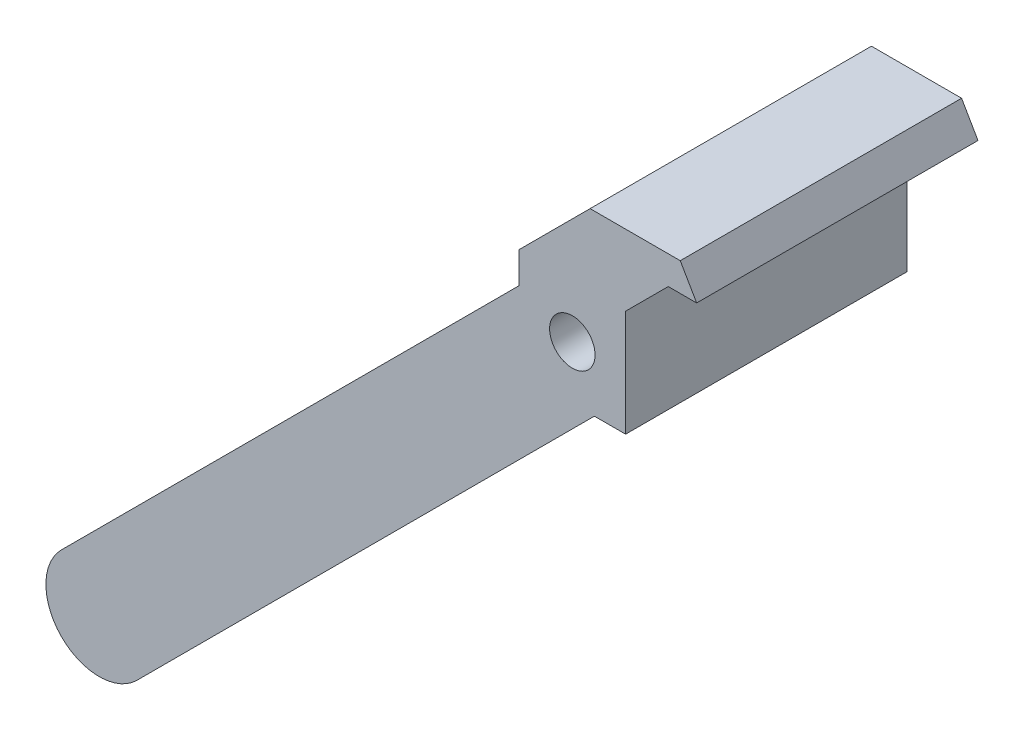
ISO-10303-21;
HEADER;
FILE_DESCRIPTION(('STEP AP214'),'2;1');
FILE_NAME('part.step','',(''),(''),'','','');
FILE_SCHEMA(('AUTOMOTIVE_DESIGN { 1 0 10303 214 1 1 1 1 }'));
ENDSEC;
DATA;
#1=APPLICATION_CONTEXT('core data for automotive mechanical design processes');
#2=APPLICATION_PROTOCOL_DEFINITION('international standard','automotive_design',2000,#1);
#3=PRODUCT_CONTEXT('',#1,'mechanical');
#4=PRODUCT('Part','Part','',(#3));
#5=PRODUCT_RELATED_PRODUCT_CATEGORY('part','',(#4));
#6=PRODUCT_DEFINITION_FORMATION('','',#4);
#7=PRODUCT_DEFINITION_CONTEXT('part definition',#1,'design');
#8=PRODUCT_DEFINITION('design','',#6,#7);
#9=PRODUCT_DEFINITION_SHAPE('','',#8);
#10=(LENGTH_UNIT() NAMED_UNIT(*) SI_UNIT(.MILLI.,.METRE.));
#11=(NAMED_UNIT(*) PLANE_ANGLE_UNIT() SI_UNIT($,.RADIAN.));
#12=(NAMED_UNIT(*) SI_UNIT($,.STERADIAN.) SOLID_ANGLE_UNIT());
#13=UNCERTAINTY_MEASURE_WITH_UNIT(LENGTH_MEASURE(1.E-05),#10,'distance_accuracy_value','');
#14=(GEOMETRIC_REPRESENTATION_CONTEXT(3) GLOBAL_UNCERTAINTY_ASSIGNED_CONTEXT((#13)) GLOBAL_UNIT_ASSIGNED_CONTEXT((#10,
#11,#12)) REPRESENTATION_CONTEXT('',''));
#15=CARTESIAN_POINT('',(0.,0.,0.));
#16=DIRECTION('',(0.,0.,1.));
#17=DIRECTION('',(1.,0.,0.));
#18=AXIS2_PLACEMENT_3D('',#15,#16,#17);
#19=CARTESIAN_POINT('',(3.75,-3.75,-9.9));
#20=DIRECTION('',(1.,0.,0.));
#21=DIRECTION('',(0.,0.,-1.));
#22=AXIS2_PLACEMENT_3D('',#19,#20,#21);
#23=PLANE('',#22);
#24=DIRECTION('',(0.,0.,1.));
#25=VECTOR('',#24,1.);
#26=CARTESIAN_POINT('',(3.75,3.75,-9.9));
#27=LINE('',#26,#25);
#28=CARTESIAN_POINT('',(3.75,3.75,-9.9));
#29=VERTEX_POINT('',#28);
#30=CARTESIAN_POINT('',(3.75,3.75,9.9));
#31=VERTEX_POINT('',#30);
#32=EDGE_CURVE('E36',#29,#31,#27,.T.);
#33=ORIENTED_EDGE('',*,*,#32,.T.);
#34=DIRECTION('',(0.,1.,0.));
#35=VECTOR('',#34,1.);
#36=CARTESIAN_POINT('',(3.75,-3.75,9.9));
#37=LINE('',#36,#35);
#38=CARTESIAN_POINT('',(3.75,-3.75,9.9));
#39=VERTEX_POINT('',#38);
#40=EDGE_CURVE('E189',#39,#31,#37,.T.);
#41=ORIENTED_EDGE('',*,*,#40,.F.);
#42=DIRECTION('',(0.,0.,1.));
#43=VECTOR('',#42,1.);
#44=CARTESIAN_POINT('',(3.75,-3.75,-9.9));
#45=LINE('',#44,#43);
#46=CARTESIAN_POINT('',(3.75,-3.75,-9.9));
#47=VERTEX_POINT('',#46);
#48=EDGE_CURVE('E11',#47,#39,#45,.T.);
#49=ORIENTED_EDGE('',*,*,#48,.F.);
#50=DIRECTION('',(0.,1.,0.));
#51=VECTOR('',#50,1.);
#52=CARTESIAN_POINT('',(3.75,-3.75,-9.9));
#53=LINE('',#52,#51);
#54=EDGE_CURVE('E199',#47,#29,#53,.T.);
#55=ORIENTED_EDGE('',*,*,#54,.T.);
#56=EDGE_LOOP('',(#33,#41,#49,#55));
#57=FACE_BOUND('',#56,.T.);
#58=ADVANCED_FACE('F33',(#57),#23,.T.);
#59=CARTESIAN_POINT('',(-3.75,-3.75,-9.9));
#60=DIRECTION('',(0.,-1.,0.));
#61=DIRECTION('',(0.,0.,-1.));
#62=AXIS2_PLACEMENT_3D('',#59,#60,#61);
#63=PLANE('',#62);
#64=DIRECTION('',(0.,0.,1.));
#65=VECTOR('',#64,1.);
#66=CARTESIAN_POINT('',(1.5533008588991,-3.75,-9.9));
#67=LINE('',#66,#65);
#68=CARTESIAN_POINT('',(1.5533008588991,-3.75,-9.9));
#69=VERTEX_POINT('',#68);
#70=CARTESIAN_POINT('',(1.5533008588991,-3.75,9.9));
#71=VERTEX_POINT('',#70);
#72=EDGE_CURVE('E57',#69,#71,#67,.T.);
#73=ORIENTED_EDGE('',*,*,#72,.F.);
#74=DIRECTION('',(1.,0.,0.));
#75=VECTOR('',#74,1.);
#76=CARTESIAN_POINT('',(-3.75,-3.75,-9.9));
#77=LINE('',#76,#75);
#78=EDGE_CURVE('E202',#69,#47,#77,.T.);
#79=ORIENTED_EDGE('',*,*,#78,.T.);
#80=ORIENTED_EDGE('',*,*,#48,.T.);
#81=DIRECTION('',(1.,0.,0.));
#82=VECTOR('',#81,1.);
#83=CARTESIAN_POINT('',(-3.75,-3.75,9.9));
#84=LINE('',#83,#82);
#85=EDGE_CURVE('E194',#71,#39,#84,.T.);
#86=ORIENTED_EDGE('',*,*,#85,.F.);
#87=EDGE_LOOP('',(#73,#79,#80,#86));
#88=FACE_BOUND('',#87,.T.);
#89=ADVANCED_FACE('F224',(#88),#63,.T.);
#90=CARTESIAN_POINT('',(-3.75,-3.75,-9.9));
#91=DIRECTION('',(-1.,0.,0.));
#92=DIRECTION('',(0.,0.,1.));
#93=AXIS2_PLACEMENT_3D('',#90,#91,#92);
#94=PLANE('',#93);
#95=DIRECTION('',(0.,0.,-1.));
#96=VECTOR('',#95,1.);
#97=CARTESIAN_POINT('',(-3.75,1.5533008588991,-9.9));
#98=LINE('',#97,#96);
#99=CARTESIAN_POINT('',(-3.75,1.5533008588991,9.9));
#100=VERTEX_POINT('',#99);
#101=CARTESIAN_POINT('',(-3.75,1.5533008588991,-9.9));
#102=VERTEX_POINT('',#101);
#103=EDGE_CURVE('E124',#100,#102,#98,.T.);
#104=ORIENTED_EDGE('',*,*,#103,.F.);
#105=DIRECTION('',(0.,-1.,0.));
#106=VECTOR('',#105,1.);
#107=CARTESIAN_POINT('',(-3.75,-3.75,9.9));
#108=LINE('',#107,#106);
#109=CARTESIAN_POINT('',(-3.75,3.75,9.9));
#110=VERTEX_POINT('',#109);
#111=EDGE_CURVE('E191',#110,#100,#108,.T.);
#112=ORIENTED_EDGE('',*,*,#111,.F.);
#113=DIRECTION('',(0.,0.,1.));
#114=VECTOR('',#113,1.);
#115=CARTESIAN_POINT('',(-3.75,3.75,-9.9));
#116=LINE('',#115,#114);
#117=CARTESIAN_POINT('',(-3.75,3.75,-9.9));
#118=VERTEX_POINT('',#117);
#119=EDGE_CURVE('E41',#118,#110,#116,.T.);
#120=ORIENTED_EDGE('',*,*,#119,.F.);
#121=DIRECTION('',(0.,-1.,0.));
#122=VECTOR('',#121,1.);
#123=CARTESIAN_POINT('',(-3.75,-3.75,-9.9));
#124=LINE('',#123,#122);
#125=EDGE_CURVE('E49',#118,#102,#124,.T.);
#126=ORIENTED_EDGE('',*,*,#125,.T.);
#127=EDGE_LOOP('',(#104,#112,#120,#126));
#128=FACE_BOUND('',#127,.T.);
#129=ADVANCED_FACE('F251',(#128),#94,.T.);
#130=CARTESIAN_POINT('',(0.,0.,-9.9));
#131=DIRECTION('',(0.,0.,-1.));
#132=DIRECTION('',(-1.,0.,0.));
#133=AXIS2_PLACEMENT_3D('',#130,#131,#132);
#134=PLANE('',#133);
#135=ORIENTED_EDGE('',*,*,#78,.F.);
#136=DIRECTION('',(0.707106781186547,0.707106781186548,0.));
#137=VECTOR('',#136,1.);
#138=CARTESIAN_POINT('',(2.65165042944955,-2.65165042944955,-9.9));
#139=LINE('',#138,#137);
#140=CARTESIAN_POINT('',(-30.6468993378384,-35.9502001967375,-9.9));
#141=VERTEX_POINT('',#140);
#142=EDGE_CURVE('E133',#141,#69,#139,.T.);
#143=ORIENTED_EDGE('',*,*,#142,.F.);
#144=CARTESIAN_POINT('',(-33.298549767288,-33.298549767288,-9.9));
#145=DIRECTION('',(0.,0.,-1.));
#146=DIRECTION('',(-1.,0.,0.));
#147=AXIS2_PLACEMENT_3D('',#144,#145,#146);
#148=CIRCLE('',#147,3.75000000000001);
#149=CARTESIAN_POINT('',(-35.9502001967375,-30.6468993378384,-9.9));
#150=VERTEX_POINT('',#149);
#151=EDGE_CURVE('E129',#150,#141,#148,.F.);
#152=ORIENTED_EDGE('',*,*,#151,.F.);
#153=DIRECTION('',(-0.707106781186548,-0.707106781186547,0.));
#154=VECTOR('',#153,1.);
#155=CARTESIAN_POINT('',(-2.65165042944955,2.65165042944955,-9.9));
#156=LINE('',#155,#154);
#157=EDGE_CURVE('E117',#102,#150,#156,.T.);
#158=ORIENTED_EDGE('',*,*,#157,.F.);
#159=ORIENTED_EDGE('',*,*,#125,.F.);
#160=DIRECTION('',(-0.707106781186546,-0.707106781186549,0.));
#161=VECTOR('',#160,1.);
#162=CARTESIAN_POINT('',(1.24999999999998,8.75,-9.9));
#163=LINE('',#162,#161);
#164=CARTESIAN_POINT('',(1.24999999999998,8.75,-9.9));
#165=VERTEX_POINT('',#164);
#166=EDGE_CURVE('E152',#165,#118,#163,.T.);
#167=ORIENTED_EDGE('',*,*,#166,.F.);
#168=DIRECTION('',(-1.,0.,0.));
#169=VECTOR('',#168,1.);
#170=CARTESIAN_POINT('',(7.59529946162072,8.75,-9.9));
#171=LINE('',#170,#169);
#172=CARTESIAN_POINT('',(7.59529946162072,8.75,-9.9));
#173=VERTEX_POINT('',#172);
#174=EDGE_CURVE('E167',#173,#165,#171,.T.);
#175=ORIENTED_EDGE('',*,*,#174,.F.);
#176=DIRECTION('',(-0.500000000000004,0.866025403784436,0.));
#177=VECTOR('',#176,1.);
#178=CARTESIAN_POINT('',(8.74999999999999,6.75,-9.9));
#179=LINE('',#178,#177);
#180=CARTESIAN_POINT('',(8.74999999999999,6.75,-9.9));
#181=VERTEX_POINT('',#180);
#182=EDGE_CURVE('E172',#181,#173,#179,.T.);
#183=ORIENTED_EDGE('',*,*,#182,.F.);
#184=DIRECTION('',(1.,0.,0.));
#185=VECTOR('',#184,1.);
#186=CARTESIAN_POINT('',(6.74999999999999,6.75,-9.9));
#187=LINE('',#186,#185);
#188=CARTESIAN_POINT('',(6.74999999999999,6.75,-9.9));
#189=VERTEX_POINT('',#188);
#190=EDGE_CURVE('E176',#189,#181,#187,.T.);
#191=ORIENTED_EDGE('',*,*,#190,.F.);
#192=DIRECTION('',(0.707106781186546,0.707106781186549,0.));
#193=VECTOR('',#192,1.);
#194=CARTESIAN_POINT('',(3.75,3.75,-9.9));
#195=LINE('',#194,#193);
#196=EDGE_CURVE('E166',#29,#189,#195,.T.);
#197=ORIENTED_EDGE('',*,*,#196,.F.);
#198=ORIENTED_EDGE('',*,*,#54,.F.);
#199=EDGE_LOOP('',(#135,#143,#152,#158,#159,#167,#175,#183,#191,#197,#198));
#200=FACE_BOUND('',#199,.T.);
#201=CARTESIAN_POINT('',(0.,0.,-9.9));
#202=DIRECTION('',(0.,0.,1.));
#203=DIRECTION('',(1.,0.,0.));
#204=AXIS2_PLACEMENT_3D('',#201,#202,#203);
#205=CIRCLE('',#204,1.6);
#206=CARTESIAN_POINT('',(1.6,0.,-9.9));
#207=VERTEX_POINT('',#206);
#208=EDGE_CURVE('E196',#207,#207,#205,.T.);
#209=ORIENTED_EDGE('',*,*,#208,.T.);
#210=EDGE_LOOP('',(#209));
#211=FACE_BOUND('',#210,.T.);
#212=ADVANCED_FACE('F130',(#200,#211),#134,.T.);
#213=CARTESIAN_POINT('',(0.,0.,-9.9));
#214=DIRECTION('',(0.,0.,1.));
#215=DIRECTION('',(1.,0.,0.));
#216=AXIS2_PLACEMENT_3D('',#213,#214,#215);
#217=CYLINDRICAL_SURFACE('',#216,1.6);
#218=CARTESIAN_POINT('',(0.,0.,9.9));
#219=DIRECTION('',(0.,0.,1.));
#220=DIRECTION('',(1.,0.,0.));
#221=AXIS2_PLACEMENT_3D('',#218,#219,#220);
#222=CIRCLE('',#221,1.6);
#223=CARTESIAN_POINT('',(1.6,0.,9.9));
#224=VERTEX_POINT('',#223);
#225=EDGE_CURVE('E186',#224,#224,#222,.T.);
#226=CARTESIAN_POINT('',(1.6,0.,-9.9));
#227=CARTESIAN_POINT('',(1.6,0.,-9.69375));
#228=CARTESIAN_POINT('',(1.6,0.,-9.4875));
#229=CARTESIAN_POINT('',(1.6,0.,-9.075));
#230=CARTESIAN_POINT('',(1.6,0.,-8.86875));
#231=CARTESIAN_POINT('',(1.6,0.,-8.45625));
#232=CARTESIAN_POINT('',(1.6,0.,-8.25));
#233=CARTESIAN_POINT('',(1.6,0.,-7.8375));
#234=CARTESIAN_POINT('',(1.6,0.,-7.63125));
#235=CARTESIAN_POINT('',(1.6,0.,-7.21875));
#236=CARTESIAN_POINT('',(1.6,0.,-7.0125));
#237=CARTESIAN_POINT('',(1.6,0.,-6.6));
#238=CARTESIAN_POINT('',(1.6,0.,-6.39375));
#239=CARTESIAN_POINT('',(1.6,0.,-5.98125));
#240=CARTESIAN_POINT('',(1.6,0.,-5.775));
#241=CARTESIAN_POINT('',(1.6,0.,-5.3625));
#242=CARTESIAN_POINT('',(1.6,0.,-5.15625));
#243=CARTESIAN_POINT('',(1.6,0.,-4.74375));
#244=CARTESIAN_POINT('',(1.6,0.,-4.5375));
#245=CARTESIAN_POINT('',(1.6,0.,-4.125));
#246=CARTESIAN_POINT('',(1.6,0.,-3.91875));
#247=CARTESIAN_POINT('',(1.6,0.,-3.50625));
#248=CARTESIAN_POINT('',(1.6,0.,-3.3));
#249=CARTESIAN_POINT('',(1.6,0.,-2.8875));
#250=CARTESIAN_POINT('',(1.6,0.,-2.68125));
#251=CARTESIAN_POINT('',(1.6,0.,-2.26875));
#252=CARTESIAN_POINT('',(1.6,0.,-2.0625));
#253=CARTESIAN_POINT('',(1.6,0.,-1.65));
#254=CARTESIAN_POINT('',(1.6,0.,-1.44375));
#255=CARTESIAN_POINT('',(1.6,0.,-1.03125));
#256=CARTESIAN_POINT('',(1.6,0.,-0.825));
#257=CARTESIAN_POINT('',(1.6,0.,-0.4125));
#258=CARTESIAN_POINT('',(1.6,0.,-0.20625));
#259=CARTESIAN_POINT('',(1.6,0.,0.20625));
#260=CARTESIAN_POINT('',(1.6,0.,0.4125));
#261=CARTESIAN_POINT('',(1.6,0.,0.825));
#262=CARTESIAN_POINT('',(1.6,0.,1.03125));
#263=CARTESIAN_POINT('',(1.6,0.,1.44375));
#264=CARTESIAN_POINT('',(1.6,0.,1.65));
#265=CARTESIAN_POINT('',(1.6,0.,2.0625));
#266=CARTESIAN_POINT('',(1.6,0.,2.26875));
#267=CARTESIAN_POINT('',(1.6,0.,2.68125));
#268=CARTESIAN_POINT('',(1.6,0.,2.8875));
#269=CARTESIAN_POINT('',(1.6,0.,3.3));
#270=CARTESIAN_POINT('',(1.6,0.,3.50625));
#271=CARTESIAN_POINT('',(1.6,0.,3.91875));
#272=CARTESIAN_POINT('',(1.6,0.,4.125));
#273=CARTESIAN_POINT('',(1.6,0.,4.5375));
#274=CARTESIAN_POINT('',(1.6,0.,4.74375));
#275=CARTESIAN_POINT('',(1.6,0.,5.15625));
#276=CARTESIAN_POINT('',(1.6,0.,5.3625));
#277=CARTESIAN_POINT('',(1.6,0.,5.775));
#278=CARTESIAN_POINT('',(1.6,0.,5.98125));
#279=CARTESIAN_POINT('',(1.6,0.,6.39375));
#280=CARTESIAN_POINT('',(1.6,0.,6.6));
#281=CARTESIAN_POINT('',(1.6,0.,7.0125));
#282=CARTESIAN_POINT('',(1.6,0.,7.21875));
#283=CARTESIAN_POINT('',(1.6,0.,7.63125));
#284=CARTESIAN_POINT('',(1.6,0.,7.8375));
#285=CARTESIAN_POINT('',(1.6,0.,8.25));
#286=CARTESIAN_POINT('',(1.6,0.,8.45625));
#287=CARTESIAN_POINT('',(1.6,0.,8.86875));
#288=CARTESIAN_POINT('',(1.6,0.,9.075));
#289=CARTESIAN_POINT('',(1.6,0.,9.4875));
#290=CARTESIAN_POINT('',(1.6,0.,9.69375));
#291=CARTESIAN_POINT('',(1.6,0.,9.9));
#292=B_SPLINE_CURVE_WITH_KNOTS('',3,(#226,#227,#228,#229,#230,#231,#232,#233,#234,#235,#236,
#237,#238,#239,#240,#241,#242,#243,#244,#245,#246,#247,#248,#249,#250,#251,#252,#253,#254,#255,
#256,#257,#258,#259,#260,#261,#262,#263,#264,#265,#266,#267,#268,#269,#270,#271,#272,#273,#274,
#275,#276,#277,#278,#279,#280,#281,#282,#283,#284,#285,#286,#287,#288,#289,#290,#291),
.UNSPECIFIED.,.F.,.F.,(4,2,2,2,2,2,2,2,2,2,2,2,2,2,2,2,2,2,2,2,2,2,2,2,2,2,2,2,2,2,2,2,4),(0.,
0.618749999999999,1.2375,1.85625,2.475,3.09375,3.7125,4.33125,4.95,5.56875,6.1875,6.80625,7.425,
8.04375,8.6625,9.28125,9.9,10.51875,11.1375,11.75625,12.375,12.99375,13.6125,14.23125,14.85,
15.46875,16.0875,16.70625,17.325,17.94375,18.5625,19.18125,19.8),.UNSPECIFIED.);
#293=EDGE_CURVE('BSEAM244',#207,#224,#292,.T.);
#294=ORIENTED_EDGE('',*,*,#208,.F.);
#295=ORIENTED_EDGE('',*,*,#225,.T.);
#296=ORIENTED_EDGE('',*,*,#293,.T.);
#297=ORIENTED_EDGE('',*,*,#293,.F.);
#298=EDGE_LOOP('',(#294,#296,#295,#297));
#299=FACE_BOUND('',#298,.T.);
#300=ADVANCED_FACE('F244',(#299),#217,.F.);
#301=CARTESIAN_POINT('',(0.,0.,9.9));
#302=DIRECTION('',(0.,0.,-1.));
#303=DIRECTION('',(-1.,0.,0.));
#304=AXIS2_PLACEMENT_3D('',#301,#302,#303);
#305=PLANE('',#304);
#306=DIRECTION('',(0.707106781186547,0.707106781186548,0.));
#307=VECTOR('',#306,1.);
#308=CARTESIAN_POINT('',(2.65165042944955,-2.65165042944955,9.9));
#309=LINE('',#308,#307);
#310=CARTESIAN_POINT('',(-30.6468993378384,-35.9502001967375,9.9));
#311=VERTEX_POINT('',#310);
#312=EDGE_CURVE('E146',#311,#71,#309,.T.);
#313=ORIENTED_EDGE('',*,*,#312,.T.);
#314=ORIENTED_EDGE('',*,*,#85,.T.);
#315=ORIENTED_EDGE('',*,*,#40,.T.);
#316=DIRECTION('',(0.707106781186546,0.707106781186549,0.));
#317=VECTOR('',#316,1.);
#318=CARTESIAN_POINT('',(3.75,3.75,9.9));
#319=LINE('',#318,#317);
#320=CARTESIAN_POINT('',(6.74999999999999,6.75,9.9));
#321=VERTEX_POINT('',#320);
#322=EDGE_CURVE('E156',#31,#321,#319,.T.);
#323=ORIENTED_EDGE('',*,*,#322,.T.);
#324=DIRECTION('',(1.,0.,0.));
#325=VECTOR('',#324,1.);
#326=CARTESIAN_POINT('',(6.74999999999999,6.75,9.9));
#327=LINE('',#326,#325);
#328=CARTESIAN_POINT('',(8.74999999999999,6.75,9.9));
#329=VERTEX_POINT('',#328);
#330=EDGE_CURVE('E153',#321,#329,#327,.T.);
#331=ORIENTED_EDGE('',*,*,#330,.T.);
#332=DIRECTION('',(-0.500000000000004,0.866025403784436,0.));
#333=VECTOR('',#332,1.);
#334=CARTESIAN_POINT('',(8.74999999999999,6.75,9.9));
#335=LINE('',#334,#333);
#336=CARTESIAN_POINT('',(7.59529946162072,8.75,9.9));
#337=VERTEX_POINT('',#336);
#338=EDGE_CURVE('E149',#329,#337,#335,.T.);
#339=ORIENTED_EDGE('',*,*,#338,.T.);
#340=DIRECTION('',(-1.,0.,0.));
#341=VECTOR('',#340,1.);
#342=CARTESIAN_POINT('',(7.59529946162072,8.75,9.9));
#343=LINE('',#342,#341);
#344=CARTESIAN_POINT('',(1.24999999999998,8.75,9.9));
#345=VERTEX_POINT('',#344);
#346=EDGE_CURVE('E148',#337,#345,#343,.T.);
#347=ORIENTED_EDGE('',*,*,#346,.T.);
#348=DIRECTION('',(-0.707106781186546,-0.707106781186549,0.));
#349=VECTOR('',#348,1.);
#350=CARTESIAN_POINT('',(1.24999999999998,8.75,9.9));
#351=LINE('',#350,#349);
#352=EDGE_CURVE('E159',#345,#110,#351,.T.);
#353=ORIENTED_EDGE('',*,*,#352,.T.);
#354=ORIENTED_EDGE('',*,*,#111,.T.);
#355=DIRECTION('',(-0.707106781186548,-0.707106781186547,0.));
#356=VECTOR('',#355,1.);
#357=CARTESIAN_POINT('',(-2.65165042944955,2.65165042944955,9.9));
#358=LINE('',#357,#356);
#359=CARTESIAN_POINT('',(-35.9502001967375,-30.6468993378384,9.9));
#360=VERTEX_POINT('',#359);
#361=EDGE_CURVE('E140',#100,#360,#358,.T.);
#362=ORIENTED_EDGE('',*,*,#361,.T.);
#363=CARTESIAN_POINT('',(-33.298549767288,-33.298549767288,9.9));
#364=DIRECTION('',(0.,0.,1.));
#365=DIRECTION('',(1.,0.,0.));
#366=AXIS2_PLACEMENT_3D('',#363,#364,#365);
#367=CIRCLE('',#366,3.75000000000001);
#368=EDGE_CURVE('E139',#360,#311,#367,.T.);
#369=ORIENTED_EDGE('',*,*,#368,.T.);
#370=EDGE_LOOP('',(#313,#314,#315,#323,#331,#339,#347,#353,#354,#362,#369));
#371=FACE_BOUND('',#370,.T.);
#372=ORIENTED_EDGE('',*,*,#225,.F.);
#373=EDGE_LOOP('',(#372));
#374=FACE_BOUND('',#373,.T.);
#375=ADVANCED_FACE('F220',(#371,#374),#305,.F.);
#376=CARTESIAN_POINT('',(1.24999999999998,8.75,-23.3629120178363));
#377=DIRECTION('',(-0.707106781186549,0.707106781186546,0.));
#378=DIRECTION('',(-0.707106781186546,-0.707106781186549,0.));
#379=AXIS2_PLACEMENT_3D('',#376,#377,#378);
#380=PLANE('',#379);
#381=DIRECTION('',(0.,0.,1.));
#382=VECTOR('',#381,1.);
#383=CARTESIAN_POINT('',(1.24999999999998,8.75,-23.3629120178363));
#384=LINE('',#383,#382);
#385=EDGE_CURVE('E170',#165,#345,#384,.T.);
#386=ORIENTED_EDGE('',*,*,#385,.F.);
#387=ORIENTED_EDGE('',*,*,#166,.T.);
#388=ORIENTED_EDGE('',*,*,#119,.T.);
#389=ORIENTED_EDGE('',*,*,#352,.F.);
#390=EDGE_LOOP('',(#386,#387,#388,#389));
#391=FACE_BOUND('',#390,.T.);
#392=ADVANCED_FACE('F235',(#391),#380,.T.);
#393=CARTESIAN_POINT('',(3.75,3.75,-23.3629120178363));
#394=DIRECTION('',(0.707106781186549,-0.707106781186546,0.));
#395=DIRECTION('',(0.707106781186546,0.707106781186549,0.));
#396=AXIS2_PLACEMENT_3D('',#393,#394,#395);
#397=PLANE('',#396);
#398=ORIENTED_EDGE('',*,*,#32,.F.);
#399=ORIENTED_EDGE('',*,*,#196,.T.);
#400=DIRECTION('',(0.,0.,1.));
#401=VECTOR('',#400,1.);
#402=CARTESIAN_POINT('',(6.74999999999999,6.75,-23.3629120178363));
#403=LINE('',#402,#401);
#404=EDGE_CURVE('E179',#189,#321,#403,.T.);
#405=ORIENTED_EDGE('',*,*,#404,.T.);
#406=ORIENTED_EDGE('',*,*,#322,.F.);
#407=EDGE_LOOP('',(#398,#399,#405,#406));
#408=FACE_BOUND('',#407,.T.);
#409=ADVANCED_FACE('F215',(#408),#397,.T.);
#410=CARTESIAN_POINT('',(6.74999999999999,6.75,-23.3629120178363));
#411=DIRECTION('',(0.,-1.,0.));
#412=DIRECTION('',(0.,0.,-1.));
#413=AXIS2_PLACEMENT_3D('',#410,#411,#412);
#414=PLANE('',#413);
#415=ORIENTED_EDGE('',*,*,#404,.F.);
#416=ORIENTED_EDGE('',*,*,#190,.T.);
#417=DIRECTION('',(0.,0.,1.));
#418=VECTOR('',#417,1.);
#419=CARTESIAN_POINT('',(8.74999999999999,6.75,-23.3629120178363));
#420=LINE('',#419,#418);
#421=EDGE_CURVE('E175',#181,#329,#420,.T.);
#422=ORIENTED_EDGE('',*,*,#421,.T.);
#423=ORIENTED_EDGE('',*,*,#330,.F.);
#424=EDGE_LOOP('',(#415,#416,#422,#423));
#425=FACE_BOUND('',#424,.T.);
#426=ADVANCED_FACE('F227',(#425),#414,.T.);
#427=CARTESIAN_POINT('',(8.74999999999999,6.75,-23.3629120178363));
#428=DIRECTION('',(0.866025403784436,0.500000000000004,0.));
#429=DIRECTION('',(-0.500000000000004,0.866025403784436,0.));
#430=AXIS2_PLACEMENT_3D('',#427,#428,#429);
#431=PLANE('',#430);
#432=ORIENTED_EDGE('',*,*,#421,.F.);
#433=ORIENTED_EDGE('',*,*,#182,.T.);
#434=DIRECTION('',(0.,0.,1.));
#435=VECTOR('',#434,1.);
#436=CARTESIAN_POINT('',(7.59529946162072,8.75,-23.3629120178363));
#437=LINE('',#436,#435);
#438=EDGE_CURVE('E171',#173,#337,#437,.T.);
#439=ORIENTED_EDGE('',*,*,#438,.T.);
#440=ORIENTED_EDGE('',*,*,#338,.F.);
#441=EDGE_LOOP('',(#432,#433,#439,#440));
#442=FACE_BOUND('',#441,.T.);
#443=ADVANCED_FACE('F229',(#442),#431,.T.);
#444=CARTESIAN_POINT('',(7.59529946162072,8.75,-23.3629120178363));
#445=DIRECTION('',(0.,1.,0.));
#446=DIRECTION('',(0.,0.,1.));
#447=AXIS2_PLACEMENT_3D('',#444,#445,#446);
#448=PLANE('',#447);
#449=ORIENTED_EDGE('',*,*,#438,.F.);
#450=ORIENTED_EDGE('',*,*,#174,.T.);
#451=ORIENTED_EDGE('',*,*,#385,.T.);
#452=ORIENTED_EDGE('',*,*,#346,.F.);
#453=EDGE_LOOP('',(#449,#450,#451,#452));
#454=FACE_BOUND('',#453,.T.);
#455=ADVANCED_FACE('F233',(#454),#448,.T.);
#456=CARTESIAN_POINT('',(2.65165042944955,-2.65165042944955,-67.5978624060523));
#457=DIRECTION('',(0.707106781186548,-0.707106781186547,0.));
#458=DIRECTION('',(0.707106781186547,0.707106781186548,0.));
#459=AXIS2_PLACEMENT_3D('',#456,#457,#458);
#460=PLANE('',#459);
#461=ORIENTED_EDGE('',*,*,#142,.T.);
#462=ORIENTED_EDGE('',*,*,#72,.T.);
#463=ORIENTED_EDGE('',*,*,#312,.F.);
#464=DIRECTION('',(0.,0.,1.));
#465=VECTOR('',#464,1.);
#466=CARTESIAN_POINT('',(-30.6468993378384,-35.9502001967375,-67.5978624060523));
#467=LINE('',#466,#465);
#468=EDGE_CURVE('E126',#141,#311,#467,.T.);
#469=ORIENTED_EDGE('',*,*,#468,.F.);
#470=EDGE_LOOP('',(#461,#462,#463,#469));
#471=FACE_BOUND('',#470,.T.);
#472=ADVANCED_FACE('F301',(#471),#460,.T.);
#473=CARTESIAN_POINT('',(-33.298549767288,-33.298549767288,-67.5978624060523));
#474=DIRECTION('',(0.,0.,1.));
#475=DIRECTION('',(1.,0.,0.));
#476=AXIS2_PLACEMENT_3D('',#473,#474,#475);
#477=CYLINDRICAL_SURFACE('',#476,3.75000000000001);
#478=DIRECTION('',(0.,0.,1.));
#479=VECTOR('',#478,1.);
#480=CARTESIAN_POINT('',(-35.9502001967375,-30.6468993378384,-67.5978624060523));
#481=LINE('',#480,#479);
#482=EDGE_CURVE('E122',#150,#360,#481,.T.);
#483=ORIENTED_EDGE('',*,*,#482,.F.);
#484=ORIENTED_EDGE('',*,*,#151,.T.);
#485=ORIENTED_EDGE('',*,*,#468,.T.);
#486=ORIENTED_EDGE('',*,*,#368,.F.);
#487=EDGE_LOOP('',(#483,#484,#485,#486));
#488=FACE_BOUND('',#487,.T.);
#489=ADVANCED_FACE('F137',(#488),#477,.T.);
#490=CARTESIAN_POINT('',(-2.65165042944955,2.65165042944955,-67.5978624060523));
#491=DIRECTION('',(-0.707106781186547,0.707106781186548,0.));
#492=DIRECTION('',(-0.707106781186548,-0.707106781186547,0.));
#493=AXIS2_PLACEMENT_3D('',#490,#491,#492);
#494=PLANE('',#493);
#495=ORIENTED_EDGE('',*,*,#361,.F.);
#496=ORIENTED_EDGE('',*,*,#103,.T.);
#497=ORIENTED_EDGE('',*,*,#157,.T.);
#498=ORIENTED_EDGE('',*,*,#482,.T.);
#499=EDGE_LOOP('',(#495,#496,#497,#498));
#500=FACE_BOUND('',#499,.T.);
#501=ADVANCED_FACE('F120',(#500),#494,.T.);
#502=CLOSED_SHELL('',(#58,#89,#129,#212,#300,#375,#392,#409,#426,#443,#455,#472,#489,#501));
#503=MANIFOLD_SOLID_BREP('B2',#502);
#504=ADVANCED_BREP_SHAPE_REPRESENTATION('',(#18,#503),#14);
#505=SHAPE_DEFINITION_REPRESENTATION(#9,#504);
ENDSEC;
END-ISO-10303-21;
